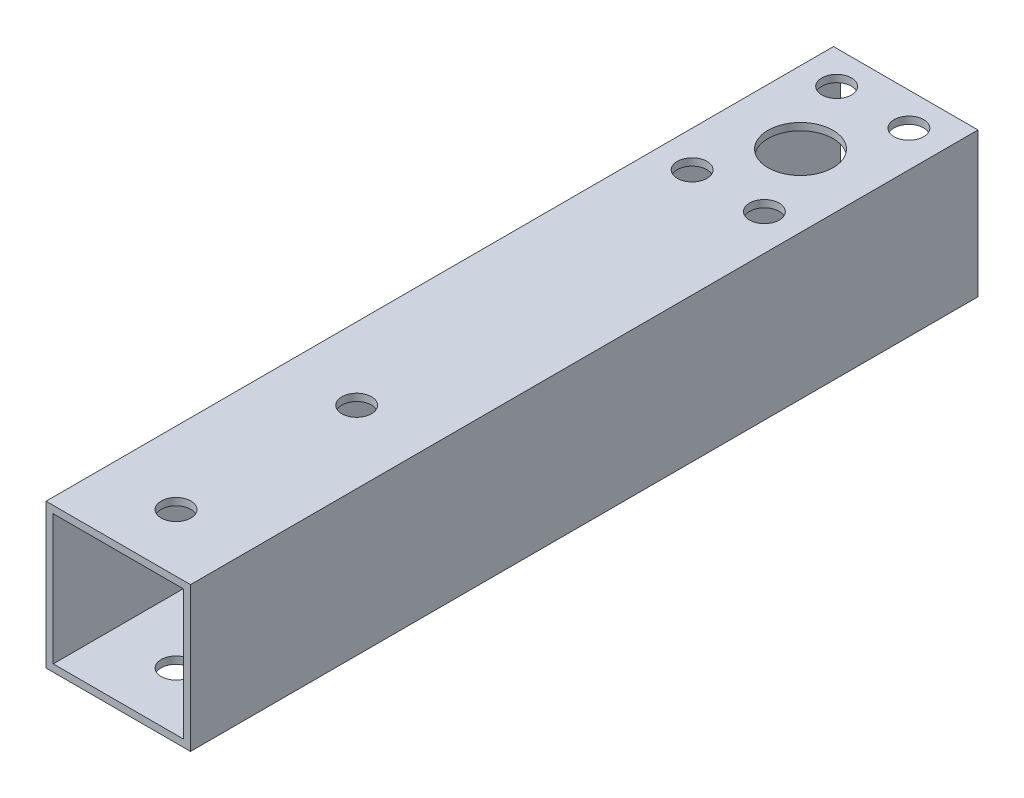
ISO-10303-21;
HEADER;
FILE_DESCRIPTION(('STEP AP214'),'2;1');
FILE_NAME('part.step','',(''),(''),'','','');
FILE_SCHEMA(('AUTOMOTIVE_DESIGN { 1 0 10303 214 1 1 1 1 }'));
ENDSEC;
DATA;
#1=APPLICATION_CONTEXT('core data for automotive mechanical design processes');
#2=APPLICATION_PROTOCOL_DEFINITION('international standard','automotive_design',2000,#1);
#3=PRODUCT_CONTEXT('',#1,'mechanical');
#4=PRODUCT('Part','Part','',(#3));
#5=PRODUCT_RELATED_PRODUCT_CATEGORY('part','',(#4));
#6=PRODUCT_DEFINITION_FORMATION('','',#4);
#7=PRODUCT_DEFINITION_CONTEXT('part definition',#1,'design');
#8=PRODUCT_DEFINITION('design','',#6,#7);
#9=PRODUCT_DEFINITION_SHAPE('','',#8);
#10=(LENGTH_UNIT() NAMED_UNIT(*) SI_UNIT(.MILLI.,.METRE.));
#11=(NAMED_UNIT(*) PLANE_ANGLE_UNIT() SI_UNIT($,.RADIAN.));
#12=(NAMED_UNIT(*) SI_UNIT($,.STERADIAN.) SOLID_ANGLE_UNIT());
#13=UNCERTAINTY_MEASURE_WITH_UNIT(LENGTH_MEASURE(1.E-05),#10,'distance_accuracy_value','');
#14=(GEOMETRIC_REPRESENTATION_CONTEXT(3) GLOBAL_UNCERTAINTY_ASSIGNED_CONTEXT((#13)) GLOBAL_UNIT_ASSIGNED_CONTEXT((#10,
#11,#12)) REPRESENTATION_CONTEXT('',''));
#15=CARTESIAN_POINT('',(0.,0.,0.));
#16=DIRECTION('',(0.,0.,1.));
#17=DIRECTION('',(1.,0.,0.));
#18=AXIS2_PLACEMENT_3D('',#15,#16,#17);
#19=CARTESIAN_POINT('',(0.,0.,54.5));
#20=DIRECTION('',(0.,0.,-1.));
#21=DIRECTION('',(-1.,0.,0.));
#22=AXIS2_PLACEMENT_3D('',#19,#20,#21);
#23=PLANE('',#22);
#24=DIRECTION('',(0.,1.,0.));
#25=VECTOR('',#24,1.);
#26=CARTESIAN_POINT('',(10.,-10.,54.5));
#27=LINE('',#26,#25);
#28=CARTESIAN_POINT('',(10.,-10.,54.5));
#29=VERTEX_POINT('',#28);
#30=CARTESIAN_POINT('',(10.,10.,54.5));
#31=VERTEX_POINT('',#30);
#32=EDGE_CURVE('E143',#29,#31,#27,.T.);
#33=ORIENTED_EDGE('',*,*,#32,.T.);
#34=DIRECTION('',(-1.,0.,0.));
#35=VECTOR('',#34,1.);
#36=CARTESIAN_POINT('',(-10.,10.,54.5));
#37=LINE('',#36,#35);
#38=CARTESIAN_POINT('',(-10.,10.,54.5));
#39=VERTEX_POINT('',#38);
#40=EDGE_CURVE('E146',#31,#39,#37,.T.);
#41=ORIENTED_EDGE('',*,*,#40,.T.);
#42=DIRECTION('',(0.,-1.,0.));
#43=VECTOR('',#42,1.);
#44=CARTESIAN_POINT('',(-10.,-10.,54.5));
#45=LINE('',#44,#43);
#46=CARTESIAN_POINT('',(-10.,-10.,54.5));
#47=VERTEX_POINT('',#46);
#48=EDGE_CURVE('E149',#39,#47,#45,.T.);
#49=ORIENTED_EDGE('',*,*,#48,.T.);
#50=DIRECTION('',(1.,0.,0.));
#51=VECTOR('',#50,1.);
#52=CARTESIAN_POINT('',(-10.,-10.,54.5));
#53=LINE('',#52,#51);
#54=EDGE_CURVE('E151',#47,#29,#53,.T.);
#55=ORIENTED_EDGE('',*,*,#54,.T.);
#56=EDGE_LOOP('',(#33,#41,#49,#55));
#57=FACE_BOUND('',#56,.T.);
#58=DIRECTION('',(1.,0.,0.));
#59=VECTOR('',#58,1.);
#60=CARTESIAN_POINT('',(-9.,-9.,54.5));
#61=LINE('',#60,#59);
#62=CARTESIAN_POINT('',(-9.,-9.,54.5));
#63=VERTEX_POINT('',#62);
#64=CARTESIAN_POINT('',(9.,-9.,54.5));
#65=VERTEX_POINT('',#64);
#66=EDGE_CURVE('E105',#63,#65,#61,.T.);
#67=ORIENTED_EDGE('',*,*,#66,.F.);
#68=DIRECTION('',(0.,-1.,0.));
#69=VECTOR('',#68,1.);
#70=CARTESIAN_POINT('',(-9.,-9.,54.5));
#71=LINE('',#70,#69);
#72=CARTESIAN_POINT('',(-9.,9.,54.5));
#73=VERTEX_POINT('',#72);
#74=EDGE_CURVE('E127',#73,#63,#71,.T.);
#75=ORIENTED_EDGE('',*,*,#74,.F.);
#76=DIRECTION('',(-1.,0.,0.));
#77=VECTOR('',#76,1.);
#78=CARTESIAN_POINT('',(-9.,9.,54.5));
#79=LINE('',#78,#77);
#80=CARTESIAN_POINT('',(9.,9.,54.5));
#81=VERTEX_POINT('',#80);
#82=EDGE_CURVE('E125',#81,#73,#79,.T.);
#83=ORIENTED_EDGE('',*,*,#82,.F.);
#84=DIRECTION('',(0.,1.,0.));
#85=VECTOR('',#84,1.);
#86=CARTESIAN_POINT('',(9.,-9.,54.5));
#87=LINE('',#86,#85);
#88=EDGE_CURVE('E113',#65,#81,#87,.T.);
#89=ORIENTED_EDGE('',*,*,#88,.F.);
#90=EDGE_LOOP('',(#67,#75,#83,#89));
#91=FACE_BOUND('',#90,.T.);
#92=ADVANCED_FACE('F38',(#57,#91),#23,.F.);
#93=CARTESIAN_POINT('',(0.,0.,-54.5));
#94=DIRECTION('',(0.,0.,-1.));
#95=DIRECTION('',(-1.,0.,0.));
#96=AXIS2_PLACEMENT_3D('',#93,#94,#95);
#97=PLANE('',#96);
#98=DIRECTION('',(0.,1.,0.));
#99=VECTOR('',#98,1.);
#100=CARTESIAN_POINT('',(10.,-10.,-54.5));
#101=LINE('',#100,#99);
#102=CARTESIAN_POINT('',(10.,-10.,-54.5));
#103=VERTEX_POINT('',#102);
#104=CARTESIAN_POINT('',(10.,10.,-54.5));
#105=VERTEX_POINT('',#104);
#106=EDGE_CURVE('E121',#103,#105,#101,.T.);
#107=ORIENTED_EDGE('',*,*,#106,.F.);
#108=DIRECTION('',(1.,0.,0.));
#109=VECTOR('',#108,1.);
#110=CARTESIAN_POINT('',(-10.,-10.,-54.5));
#111=LINE('',#110,#109);
#112=CARTESIAN_POINT('',(-10.,-10.,-54.5));
#113=VERTEX_POINT('',#112);
#114=EDGE_CURVE('E147',#113,#103,#111,.T.);
#115=ORIENTED_EDGE('',*,*,#114,.F.);
#116=DIRECTION('',(0.,-1.,0.));
#117=VECTOR('',#116,1.);
#118=CARTESIAN_POINT('',(-10.,-10.,-54.5));
#119=LINE('',#118,#117);
#120=CARTESIAN_POINT('',(-10.,10.,-54.5));
#121=VERTEX_POINT('',#120);
#122=EDGE_CURVE('E158',#121,#113,#119,.T.);
#123=ORIENTED_EDGE('',*,*,#122,.F.);
#124=DIRECTION('',(-1.,0.,0.));
#125=VECTOR('',#124,1.);
#126=CARTESIAN_POINT('',(-10.,10.,-54.5));
#127=LINE('',#126,#125);
#128=EDGE_CURVE('E156',#105,#121,#127,.T.);
#129=ORIENTED_EDGE('',*,*,#128,.F.);
#130=EDGE_LOOP('',(#107,#115,#123,#129));
#131=FACE_BOUND('',#130,.T.);
#132=DIRECTION('',(0.,-1.,0.));
#133=VECTOR('',#132,1.);
#134=CARTESIAN_POINT('',(-9.,-9.,-54.5));
#135=LINE('',#134,#133);
#136=CARTESIAN_POINT('',(-9.,9.,-54.5));
#137=VERTEX_POINT('',#136);
#138=CARTESIAN_POINT('',(-9.,-9.,-54.5));
#139=VERTEX_POINT('',#138);
#140=EDGE_CURVE('E114',#137,#139,#135,.T.);
#141=ORIENTED_EDGE('',*,*,#140,.T.);
#142=DIRECTION('',(1.,0.,0.));
#143=VECTOR('',#142,1.);
#144=CARTESIAN_POINT('',(-9.,-9.,-54.5));
#145=LINE('',#144,#143);
#146=CARTESIAN_POINT('',(9.,-9.,-54.5));
#147=VERTEX_POINT('',#146);
#148=EDGE_CURVE('E63',#139,#147,#145,.T.);
#149=ORIENTED_EDGE('',*,*,#148,.T.);
#150=DIRECTION('',(0.,1.,0.));
#151=VECTOR('',#150,1.);
#152=CARTESIAN_POINT('',(9.,-9.,-54.5));
#153=LINE('',#152,#151);
#154=CARTESIAN_POINT('',(9.,9.,-54.5));
#155=VERTEX_POINT('',#154);
#156=EDGE_CURVE('E120',#147,#155,#153,.T.);
#157=ORIENTED_EDGE('',*,*,#156,.T.);
#158=DIRECTION('',(-1.,0.,0.));
#159=VECTOR('',#158,1.);
#160=CARTESIAN_POINT('',(-9.,9.,-54.5));
#161=LINE('',#160,#159);
#162=EDGE_CURVE('E135',#155,#137,#161,.T.);
#163=ORIENTED_EDGE('',*,*,#162,.T.);
#164=EDGE_LOOP('',(#141,#149,#157,#163));
#165=FACE_BOUND('',#164,.T.);
#166=ADVANCED_FACE('F248',(#131,#165),#97,.T.);
#167=CARTESIAN_POINT('',(10.,-10.,54.5));
#168=DIRECTION('',(-1.,0.,0.));
#169=DIRECTION('',(0.,0.,1.));
#170=AXIS2_PLACEMENT_3D('',#167,#168,#169);
#171=PLANE('',#170);
#172=ORIENTED_EDGE('',*,*,#106,.T.);
#173=DIRECTION('',(0.,0.,-1.));
#174=VECTOR('',#173,1.);
#175=CARTESIAN_POINT('',(10.,10.,54.5));
#176=LINE('',#175,#174);
#177=EDGE_CURVE('E11',#31,#105,#176,.T.);
#178=ORIENTED_EDGE('',*,*,#177,.F.);
#179=ORIENTED_EDGE('',*,*,#32,.F.);
#180=DIRECTION('',(0.,0.,-1.));
#181=VECTOR('',#180,1.);
#182=CARTESIAN_POINT('',(10.,-10.,54.5));
#183=LINE('',#182,#181);
#184=EDGE_CURVE('E153',#29,#103,#183,.T.);
#185=ORIENTED_EDGE('',*,*,#184,.T.);
#186=EDGE_LOOP('',(#172,#178,#179,#185));
#187=FACE_BOUND('',#186,.T.);
#188=ADVANCED_FACE('F40',(#187),#171,.F.);
#189=CARTESIAN_POINT('',(-10.,10.,54.5));
#190=DIRECTION('',(0.,-1.,0.));
#191=DIRECTION('',(0.,0.,-1.));
#192=AXIS2_PLACEMENT_3D('',#189,#190,#191);
#193=PLANE('',#192);
#194=CARTESIAN_POINT('',(0.,10.,-39.9333870879104));
#195=DIRECTION('',(0.,1.,0.));
#196=DIRECTION('',(0.,0.,1.));
#197=AXIS2_PLACEMENT_3D('',#194,#195,#196);
#198=CIRCLE('',#197,4.5);
#199=CARTESIAN_POINT('',(0.,10.,-35.4333870879104));
#200=VERTEX_POINT('',#199);
#201=EDGE_CURVE('E275',#200,#200,#198,.T.);
#202=ORIENTED_EDGE('',*,*,#201,.F.);
#203=EDGE_LOOP('',(#202));
#204=FACE_BOUND('',#203,.T.);
#205=CARTESIAN_POINT('',(-5.00000000000001,10.,-29.9333870879105));
#206=DIRECTION('',(0.,1.,0.));
#207=DIRECTION('',(0.,0.,1.));
#208=AXIS2_PLACEMENT_3D('',#205,#206,#207);
#209=CIRCLE('',#208,2.05);
#210=CARTESIAN_POINT('',(-5.00000000000001,10.,-27.8833870879104));
#211=VERTEX_POINT('',#210);
#212=EDGE_CURVE('E279',#211,#211,#209,.T.);
#213=ORIENTED_EDGE('',*,*,#212,.F.);
#214=EDGE_LOOP('',(#213));
#215=FACE_BOUND('',#214,.T.);
#216=CARTESIAN_POINT('',(4.99999999999999,10.,-49.9333870879104));
#217=DIRECTION('',(0.,1.,0.));
#218=DIRECTION('',(0.,0.,1.));
#219=AXIS2_PLACEMENT_3D('',#216,#217,#218);
#220=CIRCLE('',#219,2.05);
#221=CARTESIAN_POINT('',(4.99999999999999,10.,-47.8833870879104));
#222=VERTEX_POINT('',#221);
#223=EDGE_CURVE('E283',#222,#222,#220,.T.);
#224=ORIENTED_EDGE('',*,*,#223,.F.);
#225=EDGE_LOOP('',(#224));
#226=FACE_BOUND('',#225,.T.);
#227=CARTESIAN_POINT('',(-5.00000000000001,10.,-49.9333870879105));
#228=DIRECTION('',(0.,1.,0.));
#229=DIRECTION('',(0.,0.,1.));
#230=AXIS2_PLACEMENT_3D('',#227,#228,#229);
#231=CIRCLE('',#230,2.05);
#232=CARTESIAN_POINT('',(-5.00000000000001,10.,-47.8833870879104));
#233=VERTEX_POINT('',#232);
#234=EDGE_CURVE('E287',#233,#233,#231,.T.);
#235=ORIENTED_EDGE('',*,*,#234,.F.);
#236=EDGE_LOOP('',(#235));
#237=FACE_BOUND('',#236,.T.);
#238=CARTESIAN_POINT('',(4.99999999999999,10.,-29.9333870879104));
#239=DIRECTION('',(0.,1.,0.));
#240=DIRECTION('',(0.,0.,1.));
#241=AXIS2_PLACEMENT_3D('',#238,#239,#240);
#242=CIRCLE('',#241,2.05);
#243=CARTESIAN_POINT('',(4.99999999999999,10.,-27.8833870879104));
#244=VERTEX_POINT('',#243);
#245=EDGE_CURVE('E182',#244,#244,#242,.T.);
#246=ORIENTED_EDGE('',*,*,#245,.F.);
#247=EDGE_LOOP('',(#246));
#248=FACE_BOUND('',#247,.T.);
#249=CARTESIAN_POINT('',(0.,10.,46.5));
#250=DIRECTION('',(0.,1.,0.));
#251=DIRECTION('',(0.,0.,1.));
#252=AXIS2_PLACEMENT_3D('',#249,#250,#251);
#253=CIRCLE('',#252,2.04999999999999);
#254=CARTESIAN_POINT('',(0.,10.,48.55));
#255=VERTEX_POINT('',#254);
#256=EDGE_CURVE('E172',#255,#255,#253,.T.);
#257=ORIENTED_EDGE('',*,*,#256,.F.);
#258=EDGE_LOOP('',(#257));
#259=FACE_BOUND('',#258,.T.);
#260=CARTESIAN_POINT('',(0.,10.,21.5));
#261=DIRECTION('',(0.,1.,0.));
#262=DIRECTION('',(0.,0.,1.));
#263=AXIS2_PLACEMENT_3D('',#260,#261,#262);
#264=CIRCLE('',#263,2.04999999999999);
#265=CARTESIAN_POINT('',(0.,10.,23.55));
#266=VERTEX_POINT('',#265);
#267=EDGE_CURVE('E211',#266,#266,#264,.T.);
#268=ORIENTED_EDGE('',*,*,#267,.F.);
#269=EDGE_LOOP('',(#268));
#270=FACE_BOUND('',#269,.T.);
#271=ORIENTED_EDGE('',*,*,#128,.T.);
#272=DIRECTION('',(0.,0.,-1.));
#273=VECTOR('',#272,1.);
#274=CARTESIAN_POINT('',(-10.,10.,54.5));
#275=LINE('',#274,#273);
#276=EDGE_CURVE('E47',#39,#121,#275,.T.);
#277=ORIENTED_EDGE('',*,*,#276,.F.);
#278=ORIENTED_EDGE('',*,*,#40,.F.);
#279=ORIENTED_EDGE('',*,*,#177,.T.);
#280=EDGE_LOOP('',(#271,#277,#278,#279));
#281=FACE_BOUND('',#280,.T.);
#282=ADVANCED_FACE('F264',(#204,#215,#226,#237,#248,#259,#270,#281),#193,.F.);
#283=CARTESIAN_POINT('',(-10.,-10.,54.5));
#284=DIRECTION('',(1.,0.,0.));
#285=DIRECTION('',(0.,0.,-1.));
#286=AXIS2_PLACEMENT_3D('',#283,#284,#285);
#287=PLANE('',#286);
#288=ORIENTED_EDGE('',*,*,#122,.T.);
#289=DIRECTION('',(0.,0.,-1.));
#290=VECTOR('',#289,1.);
#291=CARTESIAN_POINT('',(-10.,-10.,54.5));
#292=LINE('',#291,#290);
#293=EDGE_CURVE('E163',#47,#113,#292,.T.);
#294=ORIENTED_EDGE('',*,*,#293,.F.);
#295=ORIENTED_EDGE('',*,*,#48,.F.);
#296=ORIENTED_EDGE('',*,*,#276,.T.);
#297=EDGE_LOOP('',(#288,#294,#295,#296));
#298=FACE_BOUND('',#297,.T.);
#299=ADVANCED_FACE('F261',(#298),#287,.F.);
#300=CARTESIAN_POINT('',(-10.,-10.,54.5));
#301=DIRECTION('',(0.,1.,0.));
#302=DIRECTION('',(0.,0.,1.));
#303=AXIS2_PLACEMENT_3D('',#300,#301,#302);
#304=PLANE('',#303);
#305=CARTESIAN_POINT('',(0.,-10.,-39.9333870879104));
#306=DIRECTION('',(0.,1.,0.));
#307=DIRECTION('',(0.,0.,1.));
#308=AXIS2_PLACEMENT_3D('',#305,#306,#307);
#309=CIRCLE('',#308,4.5);
#310=CARTESIAN_POINT('',(0.,-10.,-35.4333870879104));
#311=VERTEX_POINT('',#310);
#312=EDGE_CURVE('E381',#311,#311,#309,.T.);
#313=ORIENTED_EDGE('',*,*,#312,.T.);
#314=EDGE_LOOP('',(#313));
#315=FACE_BOUND('',#314,.T.);
#316=CARTESIAN_POINT('',(-5.00000000000001,-10.,-29.9333870879105));
#317=DIRECTION('',(0.,1.,0.));
#318=DIRECTION('',(0.,0.,1.));
#319=AXIS2_PLACEMENT_3D('',#316,#317,#318);
#320=CIRCLE('',#319,2.05);
#321=CARTESIAN_POINT('',(-5.00000000000001,-10.,-27.8833870879104));
#322=VERTEX_POINT('',#321);
#323=EDGE_CURVE('E199',#322,#322,#320,.T.);
#324=ORIENTED_EDGE('',*,*,#323,.T.);
#325=EDGE_LOOP('',(#324));
#326=FACE_BOUND('',#325,.T.);
#327=CARTESIAN_POINT('',(4.99999999999999,-10.,-49.9333870879104));
#328=DIRECTION('',(0.,1.,0.));
#329=DIRECTION('',(0.,0.,1.));
#330=AXIS2_PLACEMENT_3D('',#327,#328,#329);
#331=CIRCLE('',#330,2.05);
#332=CARTESIAN_POINT('',(4.99999999999999,-10.,-47.8833870879104));
#333=VERTEX_POINT('',#332);
#334=EDGE_CURVE('E195',#333,#333,#331,.T.);
#335=ORIENTED_EDGE('',*,*,#334,.T.);
#336=EDGE_LOOP('',(#335));
#337=FACE_BOUND('',#336,.T.);
#338=CARTESIAN_POINT('',(-5.00000000000001,-10.,-49.9333870879105));
#339=DIRECTION('',(0.,1.,0.));
#340=DIRECTION('',(0.,0.,1.));
#341=AXIS2_PLACEMENT_3D('',#338,#339,#340);
#342=CIRCLE('',#341,2.05);
#343=CARTESIAN_POINT('',(-5.00000000000001,-10.,-47.8833870879104));
#344=VERTEX_POINT('',#343);
#345=EDGE_CURVE('E191',#344,#344,#342,.T.);
#346=ORIENTED_EDGE('',*,*,#345,.T.);
#347=EDGE_LOOP('',(#346));
#348=FACE_BOUND('',#347,.T.);
#349=CARTESIAN_POINT('',(4.99999999999999,-10.,-29.9333870879104));
#350=DIRECTION('',(0.,1.,0.));
#351=DIRECTION('',(0.,0.,1.));
#352=AXIS2_PLACEMENT_3D('',#349,#350,#351);
#353=CIRCLE('',#352,2.05);
#354=CARTESIAN_POINT('',(4.99999999999999,-10.,-27.8833870879104));
#355=VERTEX_POINT('',#354);
#356=EDGE_CURVE('E187',#355,#355,#353,.T.);
#357=ORIENTED_EDGE('',*,*,#356,.T.);
#358=EDGE_LOOP('',(#357));
#359=FACE_BOUND('',#358,.T.);
#360=CARTESIAN_POINT('',(0.,-9.99999999999999,46.5));
#361=DIRECTION('',(0.,1.,0.));
#362=DIRECTION('',(0.,0.,1.));
#363=AXIS2_PLACEMENT_3D('',#360,#361,#362);
#364=CIRCLE('',#363,2.04999999999999);
#365=CARTESIAN_POINT('',(0.,-9.99999999999999,48.55));
#366=VERTEX_POINT('',#365);
#367=EDGE_CURVE('E133',#366,#366,#364,.T.);
#368=ORIENTED_EDGE('',*,*,#367,.T.);
#369=EDGE_LOOP('',(#368));
#370=FACE_BOUND('',#369,.T.);
#371=CARTESIAN_POINT('',(0.,-9.99999999999999,21.5));
#372=DIRECTION('',(0.,1.,0.));
#373=DIRECTION('',(0.,0.,1.));
#374=AXIS2_PLACEMENT_3D('',#371,#372,#373);
#375=CIRCLE('',#374,2.04999999999999);
#376=CARTESIAN_POINT('',(0.,-9.99999999999999,23.55));
#377=VERTEX_POINT('',#376);
#378=EDGE_CURVE('E177',#377,#377,#375,.T.);
#379=ORIENTED_EDGE('',*,*,#378,.T.);
#380=EDGE_LOOP('',(#379));
#381=FACE_BOUND('',#380,.T.);
#382=ORIENTED_EDGE('',*,*,#114,.T.);
#383=ORIENTED_EDGE('',*,*,#184,.F.);
#384=ORIENTED_EDGE('',*,*,#54,.F.);
#385=ORIENTED_EDGE('',*,*,#293,.T.);
#386=EDGE_LOOP('',(#382,#383,#384,#385));
#387=FACE_BOUND('',#386,.T.);
#388=ADVANCED_FACE('F224',(#315,#326,#337,#348,#359,#370,#381,#387),#304,.F.);
#389=CARTESIAN_POINT('',(-9.,-9.,54.5));
#390=DIRECTION('',(0.,1.,0.));
#391=DIRECTION('',(0.,0.,1.));
#392=AXIS2_PLACEMENT_3D('',#389,#390,#391);
#393=PLANE('',#392);
#394=CARTESIAN_POINT('',(0.,-9.,-39.9333870879104));
#395=DIRECTION('',(0.,1.,0.));
#396=DIRECTION('',(0.,0.,1.));
#397=AXIS2_PLACEMENT_3D('',#394,#395,#396);
#398=CIRCLE('',#397,4.5);
#399=CARTESIAN_POINT('',(0.,-9.,-35.4333870879104));
#400=VERTEX_POINT('',#399);
#401=EDGE_CURVE('E329',#400,#400,#398,.T.);
#402=ORIENTED_EDGE('',*,*,#401,.F.);
#403=EDGE_LOOP('',(#402));
#404=FACE_BOUND('',#403,.T.);
#405=CARTESIAN_POINT('',(-5.00000000000001,-9.,-29.9333870879105));
#406=DIRECTION('',(0.,1.,0.));
#407=DIRECTION('',(0.,0.,1.));
#408=AXIS2_PLACEMENT_3D('',#405,#406,#407);
#409=CIRCLE('',#408,2.05);
#410=CARTESIAN_POINT('',(-5.00000000000001,-9.,-27.8833870879104));
#411=VERTEX_POINT('',#410);
#412=EDGE_CURVE('E194',#411,#411,#409,.T.);
#413=ORIENTED_EDGE('',*,*,#412,.F.);
#414=EDGE_LOOP('',(#413));
#415=FACE_BOUND('',#414,.T.);
#416=CARTESIAN_POINT('',(4.99999999999999,-9.,-49.9333870879104));
#417=DIRECTION('',(0.,1.,0.));
#418=DIRECTION('',(0.,0.,1.));
#419=AXIS2_PLACEMENT_3D('',#416,#417,#418);
#420=CIRCLE('',#419,2.05);
#421=CARTESIAN_POINT('',(4.99999999999999,-9.,-47.8833870879104));
#422=VERTEX_POINT('',#421);
#423=EDGE_CURVE('E190',#422,#422,#420,.T.);
#424=ORIENTED_EDGE('',*,*,#423,.F.);
#425=EDGE_LOOP('',(#424));
#426=FACE_BOUND('',#425,.T.);
#427=CARTESIAN_POINT('',(-5.00000000000001,-9.,-49.9333870879105));
#428=DIRECTION('',(0.,1.,0.));
#429=DIRECTION('',(0.,0.,1.));
#430=AXIS2_PLACEMENT_3D('',#427,#428,#429);
#431=CIRCLE('',#430,2.05);
#432=CARTESIAN_POINT('',(-5.00000000000001,-9.,-47.8833870879104));
#433=VERTEX_POINT('',#432);
#434=EDGE_CURVE('E186',#433,#433,#431,.T.);
#435=ORIENTED_EDGE('',*,*,#434,.F.);
#436=EDGE_LOOP('',(#435));
#437=FACE_BOUND('',#436,.T.);
#438=CARTESIAN_POINT('',(4.99999999999999,-9.,-29.9333870879104));
#439=DIRECTION('',(0.,1.,0.));
#440=DIRECTION('',(0.,0.,1.));
#441=AXIS2_PLACEMENT_3D('',#438,#439,#440);
#442=CIRCLE('',#441,2.05);
#443=CARTESIAN_POINT('',(4.99999999999999,-9.,-27.8833870879104));
#444=VERTEX_POINT('',#443);
#445=EDGE_CURVE('E181',#444,#444,#442,.T.);
#446=ORIENTED_EDGE('',*,*,#445,.F.);
#447=EDGE_LOOP('',(#446));
#448=FACE_BOUND('',#447,.T.);
#449=CARTESIAN_POINT('',(0.,-8.99999999999999,46.5));
#450=DIRECTION('',(0.,1.,0.));
#451=DIRECTION('',(0.,0.,1.));
#452=AXIS2_PLACEMENT_3D('',#449,#450,#451);
#453=CIRCLE('',#452,2.04999999999999);
#454=CARTESIAN_POINT('',(0.,-8.99999999999999,48.55));
#455=VERTEX_POINT('',#454);
#456=EDGE_CURVE('E176',#455,#455,#453,.T.);
#457=ORIENTED_EDGE('',*,*,#456,.F.);
#458=EDGE_LOOP('',(#457));
#459=FACE_BOUND('',#458,.T.);
#460=CARTESIAN_POINT('',(0.,-8.99999999999999,21.5));
#461=DIRECTION('',(0.,1.,0.));
#462=DIRECTION('',(0.,0.,1.));
#463=AXIS2_PLACEMENT_3D('',#460,#461,#462);
#464=CIRCLE('',#463,2.04999999999999);
#465=CARTESIAN_POINT('',(0.,-8.99999999999999,23.55));
#466=VERTEX_POINT('',#465);
#467=EDGE_CURVE('E171',#466,#466,#464,.T.);
#468=ORIENTED_EDGE('',*,*,#467,.F.);
#469=EDGE_LOOP('',(#468));
#470=FACE_BOUND('',#469,.T.);
#471=ORIENTED_EDGE('',*,*,#148,.F.);
#472=DIRECTION('',(0.,0.,-1.));
#473=VECTOR('',#472,1.);
#474=CARTESIAN_POINT('',(-9.,-9.,54.5));
#475=LINE('',#474,#473);
#476=EDGE_CURVE('E109',#63,#139,#475,.T.);
#477=ORIENTED_EDGE('',*,*,#476,.F.);
#478=ORIENTED_EDGE('',*,*,#66,.T.);
#479=DIRECTION('',(0.,0.,-1.));
#480=VECTOR('',#479,1.);
#481=CARTESIAN_POINT('',(9.,-9.,54.5));
#482=LINE('',#481,#480);
#483=EDGE_CURVE('E108',#65,#147,#482,.T.);
#484=ORIENTED_EDGE('',*,*,#483,.T.);
#485=EDGE_LOOP('',(#471,#477,#478,#484));
#486=FACE_BOUND('',#485,.T.);
#487=ADVANCED_FACE('F107',(#404,#415,#426,#437,#448,#459,#470,#486),#393,.T.);
#488=CARTESIAN_POINT('',(9.,-9.,54.5));
#489=DIRECTION('',(-1.,0.,0.));
#490=DIRECTION('',(0.,0.,1.));
#491=AXIS2_PLACEMENT_3D('',#488,#489,#490);
#492=PLANE('',#491);
#493=ORIENTED_EDGE('',*,*,#156,.F.);
#494=ORIENTED_EDGE('',*,*,#483,.F.);
#495=ORIENTED_EDGE('',*,*,#88,.T.);
#496=DIRECTION('',(0.,0.,-1.));
#497=VECTOR('',#496,1.);
#498=CARTESIAN_POINT('',(9.,9.,54.5));
#499=LINE('',#498,#497);
#500=EDGE_CURVE('E122',#81,#155,#499,.T.);
#501=ORIENTED_EDGE('',*,*,#500,.T.);
#502=EDGE_LOOP('',(#493,#494,#495,#501));
#503=FACE_BOUND('',#502,.T.);
#504=ADVANCED_FACE('F117',(#503),#492,.T.);
#505=CARTESIAN_POINT('',(-9.,9.,54.5));
#506=DIRECTION('',(0.,-1.,0.));
#507=DIRECTION('',(0.,0.,-1.));
#508=AXIS2_PLACEMENT_3D('',#505,#506,#507);
#509=PLANE('',#508);
#510=CARTESIAN_POINT('',(0.,9.,-39.9333870879104));
#511=DIRECTION('',(0.,-1.,0.));
#512=DIRECTION('',(0.,0.,-1.));
#513=AXIS2_PLACEMENT_3D('',#510,#511,#512);
#514=CIRCLE('',#513,4.5);
#515=CARTESIAN_POINT('',(0.,9.,-44.4333870879104));
#516=VERTEX_POINT('',#515);
#517=EDGE_CURVE('E42',#516,#516,#514,.T.);
#518=ORIENTED_EDGE('',*,*,#517,.F.);
#519=EDGE_LOOP('',(#518));
#520=FACE_BOUND('',#519,.T.);
#521=CARTESIAN_POINT('',(-5.00000000000001,9.,-29.9333870879105));
#522=DIRECTION('',(0.,-1.,0.));
#523=DIRECTION('',(0.,0.,-1.));
#524=AXIS2_PLACEMENT_3D('',#521,#522,#523);
#525=CIRCLE('',#524,2.05);
#526=CARTESIAN_POINT('',(-5.00000000000001,9.,-31.9833870879105));
#527=VERTEX_POINT('',#526);
#528=EDGE_CURVE('E192',#527,#527,#525,.T.);
#529=ORIENTED_EDGE('',*,*,#528,.F.);
#530=EDGE_LOOP('',(#529));
#531=FACE_BOUND('',#530,.T.);
#532=CARTESIAN_POINT('',(4.99999999999999,9.,-49.9333870879104));
#533=DIRECTION('',(0.,-1.,0.));
#534=DIRECTION('',(0.,0.,-1.));
#535=AXIS2_PLACEMENT_3D('',#532,#533,#534);
#536=CIRCLE('',#535,2.05);
#537=CARTESIAN_POINT('',(4.99999999999999,9.,-51.9833870879105));
#538=VERTEX_POINT('',#537);
#539=EDGE_CURVE('E188',#538,#538,#536,.T.);
#540=ORIENTED_EDGE('',*,*,#539,.F.);
#541=EDGE_LOOP('',(#540));
#542=FACE_BOUND('',#541,.T.);
#543=CARTESIAN_POINT('',(-5.00000000000001,9.,-49.9333870879105));
#544=DIRECTION('',(0.,-1.,0.));
#545=DIRECTION('',(0.,0.,-1.));
#546=AXIS2_PLACEMENT_3D('',#543,#544,#545);
#547=CIRCLE('',#546,2.05);
#548=CARTESIAN_POINT('',(-5.00000000000001,9.,-51.9833870879105));
#549=VERTEX_POINT('',#548);
#550=EDGE_CURVE('E183',#549,#549,#547,.T.);
#551=ORIENTED_EDGE('',*,*,#550,.F.);
#552=EDGE_LOOP('',(#551));
#553=FACE_BOUND('',#552,.T.);
#554=CARTESIAN_POINT('',(4.99999999999999,9.,-29.9333870879104));
#555=DIRECTION('',(0.,-1.,0.));
#556=DIRECTION('',(0.,0.,-1.));
#557=AXIS2_PLACEMENT_3D('',#554,#555,#556);
#558=CIRCLE('',#557,2.05);
#559=CARTESIAN_POINT('',(4.99999999999999,9.,-31.9833870879104));
#560=VERTEX_POINT('',#559);
#561=EDGE_CURVE('E178',#560,#560,#558,.T.);
#562=ORIENTED_EDGE('',*,*,#561,.F.);
#563=EDGE_LOOP('',(#562));
#564=FACE_BOUND('',#563,.T.);
#565=CARTESIAN_POINT('',(0.,9.00000000000001,46.5));
#566=DIRECTION('',(0.,-1.,0.));
#567=DIRECTION('',(0.,0.,-1.));
#568=AXIS2_PLACEMENT_3D('',#565,#566,#567);
#569=CIRCLE('',#568,2.04999999999999);
#570=CARTESIAN_POINT('',(0.,9.00000000000001,44.45));
#571=VERTEX_POINT('',#570);
#572=EDGE_CURVE('E173',#571,#571,#569,.T.);
#573=ORIENTED_EDGE('',*,*,#572,.F.);
#574=EDGE_LOOP('',(#573));
#575=FACE_BOUND('',#574,.T.);
#576=CARTESIAN_POINT('',(0.,9.00000000000001,21.5));
#577=DIRECTION('',(0.,-1.,0.));
#578=DIRECTION('',(0.,0.,-1.));
#579=AXIS2_PLACEMENT_3D('',#576,#577,#578);
#580=CIRCLE('',#579,2.04999999999999);
#581=CARTESIAN_POINT('',(0.,9.00000000000001,19.45));
#582=VERTEX_POINT('',#581);
#583=EDGE_CURVE('E168',#582,#582,#580,.T.);
#584=ORIENTED_EDGE('',*,*,#583,.F.);
#585=EDGE_LOOP('',(#584));
#586=FACE_BOUND('',#585,.T.);
#587=ORIENTED_EDGE('',*,*,#162,.F.);
#588=ORIENTED_EDGE('',*,*,#500,.F.);
#589=ORIENTED_EDGE('',*,*,#82,.T.);
#590=DIRECTION('',(0.,0.,-1.));
#591=VECTOR('',#590,1.);
#592=CARTESIAN_POINT('',(-9.,9.,54.5));
#593=LINE('',#592,#591);
#594=EDGE_CURVE('E55',#73,#137,#593,.T.);
#595=ORIENTED_EDGE('',*,*,#594,.T.);
#596=EDGE_LOOP('',(#587,#588,#589,#595));
#597=FACE_BOUND('',#596,.T.);
#598=ADVANCED_FACE('F310',(#520,#531,#542,#553,#564,#575,#586,#597),#509,.T.);
#599=CARTESIAN_POINT('',(-9.,-9.,54.5));
#600=DIRECTION('',(1.,0.,0.));
#601=DIRECTION('',(0.,0.,-1.));
#602=AXIS2_PLACEMENT_3D('',#599,#600,#601);
#603=PLANE('',#602);
#604=ORIENTED_EDGE('',*,*,#140,.F.);
#605=ORIENTED_EDGE('',*,*,#594,.F.);
#606=ORIENTED_EDGE('',*,*,#74,.T.);
#607=ORIENTED_EDGE('',*,*,#476,.T.);
#608=EDGE_LOOP('',(#604,#605,#606,#607));
#609=FACE_BOUND('',#608,.T.);
#610=ADVANCED_FACE('F308',(#609),#603,.T.);
#611=CARTESIAN_POINT('',(0.,-92.,21.5));
#612=DIRECTION('',(0.,1.,0.));
#613=DIRECTION('',(0.,0.,1.));
#614=AXIS2_PLACEMENT_3D('',#611,#612,#613);
#615=CYLINDRICAL_SURFACE('',#614,2.04999999999999);
#616=ORIENTED_EDGE('',*,*,#583,.T.);
#617=EDGE_LOOP('',(#616));
#618=FACE_BOUND('',#617,.T.);
#619=ORIENTED_EDGE('',*,*,#267,.T.);
#620=EDGE_LOOP('',(#619));
#621=FACE_BOUND('',#620,.T.);
#622=ADVANCED_FACE('F244',(#618,#621),#615,.F.);
#623=CARTESIAN_POINT('',(0.,-92.,46.5));
#624=DIRECTION('',(0.,1.,0.));
#625=DIRECTION('',(0.,0.,1.));
#626=AXIS2_PLACEMENT_3D('',#623,#624,#625);
#627=CYLINDRICAL_SURFACE('',#626,2.04999999999999);
#628=ORIENTED_EDGE('',*,*,#572,.T.);
#629=EDGE_LOOP('',(#628));
#630=FACE_BOUND('',#629,.T.);
#631=ORIENTED_EDGE('',*,*,#256,.T.);
#632=EDGE_LOOP('',(#631));
#633=FACE_BOUND('',#632,.T.);
#634=ADVANCED_FACE('F233',(#630,#633),#627,.F.);
#635=ORIENTED_EDGE('',*,*,#467,.T.);
#636=EDGE_LOOP('',(#635));
#637=FACE_BOUND('',#636,.T.);
#638=ORIENTED_EDGE('',*,*,#378,.F.);
#639=EDGE_LOOP('',(#638));
#640=FACE_BOUND('',#639,.T.);
#641=ADVANCED_FACE('F230',(#637,#640),#615,.F.);
#642=ORIENTED_EDGE('',*,*,#456,.T.);
#643=EDGE_LOOP('',(#642));
#644=FACE_BOUND('',#643,.T.);
#645=ORIENTED_EDGE('',*,*,#367,.F.);
#646=EDGE_LOOP('',(#645));
#647=FACE_BOUND('',#646,.T.);
#648=ADVANCED_FACE('F227',(#644,#647),#627,.F.);
#649=CARTESIAN_POINT('',(4.99999999999999,-40.,-29.9333870879104));
#650=DIRECTION('',(0.,1.,0.));
#651=DIRECTION('',(0.,0.,1.));
#652=AXIS2_PLACEMENT_3D('',#649,#650,#651);
#653=CYLINDRICAL_SURFACE('',#652,2.05);
#654=ORIENTED_EDGE('',*,*,#561,.T.);
#655=EDGE_LOOP('',(#654));
#656=FACE_BOUND('',#655,.T.);
#657=ORIENTED_EDGE('',*,*,#245,.T.);
#658=EDGE_LOOP('',(#657));
#659=FACE_BOUND('',#658,.T.);
#660=ADVANCED_FACE('F229',(#656,#659),#653,.F.);
#661=CARTESIAN_POINT('',(-5.00000000000001,-40.,-49.9333870879105));
#662=DIRECTION('',(0.,1.,0.));
#663=DIRECTION('',(0.,0.,1.));
#664=AXIS2_PLACEMENT_3D('',#661,#662,#663);
#665=CYLINDRICAL_SURFACE('',#664,2.05);
#666=ORIENTED_EDGE('',*,*,#550,.T.);
#667=EDGE_LOOP('',(#666));
#668=FACE_BOUND('',#667,.T.);
#669=ORIENTED_EDGE('',*,*,#234,.T.);
#670=EDGE_LOOP('',(#669));
#671=FACE_BOUND('',#670,.T.);
#672=ADVANCED_FACE('F238',(#668,#671),#665,.F.);
#673=CARTESIAN_POINT('',(4.99999999999999,-40.,-49.9333870879104));
#674=DIRECTION('',(0.,1.,0.));
#675=DIRECTION('',(0.,0.,1.));
#676=AXIS2_PLACEMENT_3D('',#673,#674,#675);
#677=CYLINDRICAL_SURFACE('',#676,2.05);
#678=ORIENTED_EDGE('',*,*,#539,.T.);
#679=EDGE_LOOP('',(#678));
#680=FACE_BOUND('',#679,.T.);
#681=ORIENTED_EDGE('',*,*,#223,.T.);
#682=EDGE_LOOP('',(#681));
#683=FACE_BOUND('',#682,.T.);
#684=ADVANCED_FACE('F369',(#680,#683),#677,.F.);
#685=CARTESIAN_POINT('',(-5.00000000000001,-40.,-29.9333870879105));
#686=DIRECTION('',(0.,1.,0.));
#687=DIRECTION('',(0.,0.,1.));
#688=AXIS2_PLACEMENT_3D('',#685,#686,#687);
#689=CYLINDRICAL_SURFACE('',#688,2.05);
#690=ORIENTED_EDGE('',*,*,#528,.T.);
#691=EDGE_LOOP('',(#690));
#692=FACE_BOUND('',#691,.T.);
#693=ORIENTED_EDGE('',*,*,#212,.T.);
#694=EDGE_LOOP('',(#693));
#695=FACE_BOUND('',#694,.T.);
#696=ADVANCED_FACE('F370',(#692,#695),#689,.F.);
#697=ORIENTED_EDGE('',*,*,#445,.T.);
#698=EDGE_LOOP('',(#697));
#699=FACE_BOUND('',#698,.T.);
#700=ORIENTED_EDGE('',*,*,#356,.F.);
#701=EDGE_LOOP('',(#700));
#702=FACE_BOUND('',#701,.T.);
#703=ADVANCED_FACE('F241',(#699,#702),#653,.F.);
#704=ORIENTED_EDGE('',*,*,#434,.T.);
#705=EDGE_LOOP('',(#704));
#706=FACE_BOUND('',#705,.T.);
#707=ORIENTED_EDGE('',*,*,#345,.F.);
#708=EDGE_LOOP('',(#707));
#709=FACE_BOUND('',#708,.T.);
#710=ADVANCED_FACE('F357',(#706,#709),#665,.F.);
#711=ORIENTED_EDGE('',*,*,#423,.T.);
#712=EDGE_LOOP('',(#711));
#713=FACE_BOUND('',#712,.T.);
#714=ORIENTED_EDGE('',*,*,#334,.F.);
#715=EDGE_LOOP('',(#714));
#716=FACE_BOUND('',#715,.T.);
#717=ADVANCED_FACE('F359',(#713,#716),#677,.F.);
#718=ORIENTED_EDGE('',*,*,#412,.T.);
#719=EDGE_LOOP('',(#718));
#720=FACE_BOUND('',#719,.T.);
#721=ORIENTED_EDGE('',*,*,#323,.F.);
#722=EDGE_LOOP('',(#721));
#723=FACE_BOUND('',#722,.T.);
#724=ADVANCED_FACE('F366',(#720,#723),#689,.F.);
#725=CARTESIAN_POINT('',(0.,-30.,-39.9333870879104));
#726=DIRECTION('',(0.,1.,0.));
#727=DIRECTION('',(0.,0.,1.));
#728=AXIS2_PLACEMENT_3D('',#725,#726,#727);
#729=CYLINDRICAL_SURFACE('',#728,4.5);
#730=ORIENTED_EDGE('',*,*,#517,.T.);
#731=EDGE_LOOP('',(#730));
#732=FACE_BOUND('',#731,.T.);
#733=ORIENTED_EDGE('',*,*,#201,.T.);
#734=EDGE_LOOP('',(#733));
#735=FACE_BOUND('',#734,.T.);
#736=ADVANCED_FACE('F393',(#732,#735),#729,.F.);
#737=ORIENTED_EDGE('',*,*,#401,.T.);
#738=EDGE_LOOP('',(#737));
#739=FACE_BOUND('',#738,.T.);
#740=ORIENTED_EDGE('',*,*,#312,.F.);
#741=EDGE_LOOP('',(#740));
#742=FACE_BOUND('',#741,.T.);
#743=ADVANCED_FACE('F398',(#739,#742),#729,.F.);
#744=CLOSED_SHELL('',(#92,#166,#188,#282,#299,#388,#487,#504,#598,#610,#622,#634,#641,#648,#660,
#672,#684,#696,#703,#710,#717,#724,#736,#743));
#745=MANIFOLD_SOLID_BREP('B2',#744);
#746=ADVANCED_BREP_SHAPE_REPRESENTATION('',(#18,#745),#14);
#747=SHAPE_DEFINITION_REPRESENTATION(#9,#746);
ENDSEC;
END-ISO-10303-21;
